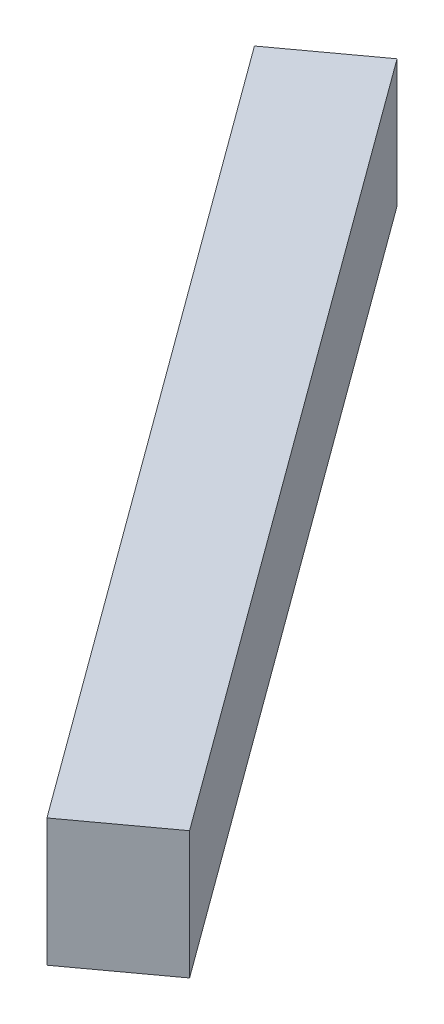
ISO-10303-21;
HEADER;
FILE_DESCRIPTION(('STEP AP214'),'2;1');
FILE_NAME('part.step','',(''),(''),'','','');
FILE_SCHEMA(('AUTOMOTIVE_DESIGN { 1 0 10303 214 1 1 1 1 }'));
ENDSEC;
DATA;
#1=APPLICATION_CONTEXT('core data for automotive mechanical design processes');
#2=APPLICATION_PROTOCOL_DEFINITION('international standard','automotive_design',2000,#1);
#3=PRODUCT_CONTEXT('',#1,'mechanical');
#4=PRODUCT('Part','Part','',(#3));
#5=PRODUCT_RELATED_PRODUCT_CATEGORY('part','',(#4));
#6=PRODUCT_DEFINITION_FORMATION('','',#4);
#7=PRODUCT_DEFINITION_CONTEXT('part definition',#1,'design');
#8=PRODUCT_DEFINITION('design','',#6,#7);
#9=PRODUCT_DEFINITION_SHAPE('','',#8);
#10=(LENGTH_UNIT() NAMED_UNIT(*) SI_UNIT(.MILLI.,.METRE.));
#11=(NAMED_UNIT(*) PLANE_ANGLE_UNIT() SI_UNIT($,.RADIAN.));
#12=(NAMED_UNIT(*) SI_UNIT($,.STERADIAN.) SOLID_ANGLE_UNIT());
#13=UNCERTAINTY_MEASURE_WITH_UNIT(LENGTH_MEASURE(1.E-05),#10,'distance_accuracy_value','');
#14=(GEOMETRIC_REPRESENTATION_CONTEXT(3) GLOBAL_UNCERTAINTY_ASSIGNED_CONTEXT((#13)) GLOBAL_UNIT_ASSIGNED_CONTEXT((#10,
#11,#12)) REPRESENTATION_CONTEXT('',''));
#15=CARTESIAN_POINT('',(0.,0.,0.));
#16=DIRECTION('',(0.,0.,1.));
#17=DIRECTION('',(1.,0.,0.));
#18=AXIS2_PLACEMENT_3D('',#15,#16,#17);
#19=CARTESIAN_POINT('',(10.705830066975,7.874,14.4680193834721));
#20=DIRECTION('',(-0.807187028946262,0.,0.590295773575338));
#21=DIRECTION('',(0.590295773575338,0.,0.807187028946262));
#22=AXIS2_PLACEMENT_3D('',#19,#20,#21);
#23=PLANE('',#22);
#24=DIRECTION('',(0.,1.,0.));
#25=VECTOR('',#24,1.);
#26=CARTESIAN_POINT('',(10.705830066975,7.874,14.4680193834721));
#27=LINE('',#26,#25);
#28=CARTESIAN_POINT('',(10.705830066975,7.62,14.4680193834721));
#29=VERTEX_POINT('',#28);
#30=CARTESIAN_POINT('',(10.705830066975,7.874,14.4680193834721));
#31=VERTEX_POINT('',#30);
#32=EDGE_CURVE('E20',#29,#31,#27,.T.);
#33=ORIENTED_EDGE('',*,*,#32,.T.);
#34=DIRECTION('',(-0.590295773575338,0.,-0.807187028946262));
#35=VECTOR('',#34,1.);
#36=CARTESIAN_POINT('',(11.830343515636,7.874,16.0057106736147));
#37=LINE('',#36,#35);
#38=CARTESIAN_POINT('',(11.830343515636,7.874,16.0057106736147));
#39=VERTEX_POINT('',#38);
#40=EDGE_CURVE('E55',#39,#31,#37,.T.);
#41=ORIENTED_EDGE('',*,*,#40,.F.);
#42=DIRECTION('',(0.,1.,0.));
#43=VECTOR('',#42,1.);
#44=CARTESIAN_POINT('',(11.830343515636,7.874,16.0057106736147));
#45=LINE('',#44,#43);
#46=CARTESIAN_POINT('',(11.830343515636,7.62,16.0057106736147));
#47=VERTEX_POINT('',#46);
#48=EDGE_CURVE('E76',#39,#47,#45,.F.);
#49=ORIENTED_EDGE('',*,*,#48,.T.);
#50=DIRECTION('',(-0.590295773575338,0.,-0.807187028946262));
#51=VECTOR('',#50,1.);
#52=CARTESIAN_POINT('',(11.830343515636,7.62,16.0057106736147));
#53=LINE('',#52,#51);
#54=EDGE_CURVE('E58',#47,#29,#53,.T.);
#55=ORIENTED_EDGE('',*,*,#54,.T.);
#56=EDGE_LOOP('',(#33,#41,#49,#55));
#57=FACE_BOUND('',#56,.T.);
#58=ADVANCED_FACE('F17',(#57),#23,.F.);
#59=CARTESIAN_POINT('',(10.705830066975,7.874,14.4680193834721));
#60=DIRECTION('',(0.590295773575359,0.,0.807187028946246));
#61=DIRECTION('',(0.807187028946246,0.,-0.590295773575359));
#62=AXIS2_PLACEMENT_3D('',#59,#60,#61);
#63=PLANE('',#62);
#64=DIRECTION('',(0.,1.,0.));
#65=VECTOR('',#64,1.);
#66=CARTESIAN_POINT('',(10.5418096626931,7.874,14.5879674846626));
#67=LINE('',#66,#65);
#68=CARTESIAN_POINT('',(10.5418096626931,7.62,14.5879674846626));
#69=VERTEX_POINT('',#68);
#70=CARTESIAN_POINT('',(10.5418096626931,7.874,14.5879674846626));
#71=VERTEX_POINT('',#70);
#72=EDGE_CURVE('E73',#69,#71,#67,.T.);
#73=ORIENTED_EDGE('',*,*,#72,.T.);
#74=DIRECTION('',(-0.807187028946319,0.,0.59029577357526));
#75=VECTOR('',#74,1.);
#76=CARTESIAN_POINT('',(10.705830066975,7.874,14.4680193834721));
#77=LINE('',#76,#75);
#78=EDGE_CURVE('E63',#31,#71,#77,.T.);
#79=ORIENTED_EDGE('',*,*,#78,.F.);
#80=ORIENTED_EDGE('',*,*,#32,.F.);
#81=DIRECTION('',(-0.807187028946319,0.,0.59029577357526));
#82=VECTOR('',#81,1.);
#83=CARTESIAN_POINT('',(10.705830066975,7.62,14.4680193834721));
#84=LINE('',#83,#82);
#85=EDGE_CURVE('E80',#29,#69,#84,.T.);
#86=ORIENTED_EDGE('',*,*,#85,.T.);
#87=EDGE_LOOP('',(#73,#79,#80,#86));
#88=FACE_BOUND('',#87,.T.);
#89=ADVANCED_FACE('F72',(#88),#63,.F.);
#90=CARTESIAN_POINT('',(10.5418096626931,7.874,14.5879674846626));
#91=DIRECTION('',(0.,1.,0.));
#92=DIRECTION('',(0.,0.,1.));
#93=AXIS2_PLACEMENT_3D('',#90,#91,#92);
#94=PLANE('',#93);
#95=DIRECTION('',(-0.80718702804767,0.,0.590295774804097));
#96=VECTOR('',#95,1.);
#97=CARTESIAN_POINT('',(11.830343515636,7.874,16.0057106736147));
#98=LINE('',#97,#96);
#99=CARTESIAN_POINT('',(11.6663231115367,7.874,16.1256587750549));
#100=VERTEX_POINT('',#99);
#101=EDGE_CURVE('E69',#100,#39,#98,.F.);
#102=ORIENTED_EDGE('',*,*,#101,.T.);
#103=ORIENTED_EDGE('',*,*,#40,.T.);
#104=ORIENTED_EDGE('',*,*,#78,.T.);
#105=DIRECTION('',(-0.590295773575338,0.,-0.807187028946262));
#106=VECTOR('',#105,1.);
#107=CARTESIAN_POINT('',(10.5418096626931,7.874,14.5879674846626));
#108=LINE('',#107,#106);
#109=EDGE_CURVE('E83',#71,#100,#108,.F.);
#110=ORIENTED_EDGE('',*,*,#109,.T.);
#111=EDGE_LOOP('',(#102,#103,#104,#110));
#112=FACE_BOUND('',#111,.T.);
#113=ADVANCED_FACE('F66',(#112),#94,.T.);
#114=CARTESIAN_POINT('',(11.830343515636,7.874,16.0057106736147));
#115=DIRECTION('',(-0.590295774804097,0.,-0.80718702804767));
#116=DIRECTION('',(-0.80718702804767,0.,0.590295774804097));
#117=AXIS2_PLACEMENT_3D('',#114,#115,#116);
#118=PLANE('',#117);
#119=ORIENTED_EDGE('',*,*,#48,.F.);
#120=ORIENTED_EDGE('',*,*,#101,.F.);
#121=DIRECTION('',(0.,1.,0.));
#122=VECTOR('',#121,1.);
#123=CARTESIAN_POINT('',(11.6663231115367,7.874,16.1256587750549));
#124=LINE('',#123,#122);
#125=CARTESIAN_POINT('',(11.6663231115367,7.62,16.1256587750549));
#126=VERTEX_POINT('',#125);
#127=EDGE_CURVE('E26',#100,#126,#124,.F.);
#128=ORIENTED_EDGE('',*,*,#127,.T.);
#129=DIRECTION('',(0.807187028047672,0.,-0.590295774804095));
#130=VECTOR('',#129,1.);
#131=CARTESIAN_POINT('',(11.6663231115367,7.62,16.1256587750549));
#132=LINE('',#131,#130);
#133=EDGE_CURVE('E34',#126,#47,#132,.T.);
#134=ORIENTED_EDGE('',*,*,#133,.T.);
#135=EDGE_LOOP('',(#119,#120,#128,#134));
#136=FACE_BOUND('',#135,.T.);
#137=ADVANCED_FACE('F88',(#136),#118,.F.);
#138=CARTESIAN_POINT('',(10.5418096626931,7.62,14.5879674846626));
#139=DIRECTION('',(0.,1.,0.));
#140=DIRECTION('',(0.,0.,1.));
#141=AXIS2_PLACEMENT_3D('',#138,#139,#140);
#142=PLANE('',#141);
#143=ORIENTED_EDGE('',*,*,#54,.F.);
#144=ORIENTED_EDGE('',*,*,#133,.F.);
#145=DIRECTION('',(-0.590295773575338,0.,-0.807187028946262));
#146=VECTOR('',#145,1.);
#147=CARTESIAN_POINT('',(10.5418096626931,7.62,14.5879674846626));
#148=LINE('',#147,#146);
#149=EDGE_CURVE('E11',#126,#69,#148,.T.);
#150=ORIENTED_EDGE('',*,*,#149,.T.);
#151=ORIENTED_EDGE('',*,*,#85,.F.);
#152=EDGE_LOOP('',(#143,#144,#150,#151));
#153=FACE_BOUND('',#152,.T.);
#154=ADVANCED_FACE('F91',(#153),#142,.F.);
#155=CARTESIAN_POINT('',(10.5418096626931,7.874,14.5879674846626));
#156=DIRECTION('',(0.807187028946262,0.,-0.590295773575338));
#157=DIRECTION('',(-0.590295773575338,0.,-0.807187028946262));
#158=AXIS2_PLACEMENT_3D('',#155,#156,#157);
#159=PLANE('',#158);
#160=ORIENTED_EDGE('',*,*,#127,.F.);
#161=ORIENTED_EDGE('',*,*,#109,.F.);
#162=ORIENTED_EDGE('',*,*,#72,.F.);
#163=ORIENTED_EDGE('',*,*,#149,.F.);
#164=EDGE_LOOP('',(#160,#161,#162,#163));
#165=FACE_BOUND('',#164,.T.);
#166=ADVANCED_FACE('F90',(#165),#159,.F.);
#167=CLOSED_SHELL('',(#58,#89,#113,#137,#154,#166));
#168=MANIFOLD_SOLID_BREP('B1',#167);
#169=ADVANCED_BREP_SHAPE_REPRESENTATION('',(#18,#168),#14);
#170=SHAPE_DEFINITION_REPRESENTATION(#9,#169);
ENDSEC;
END-ISO-10303-21;
